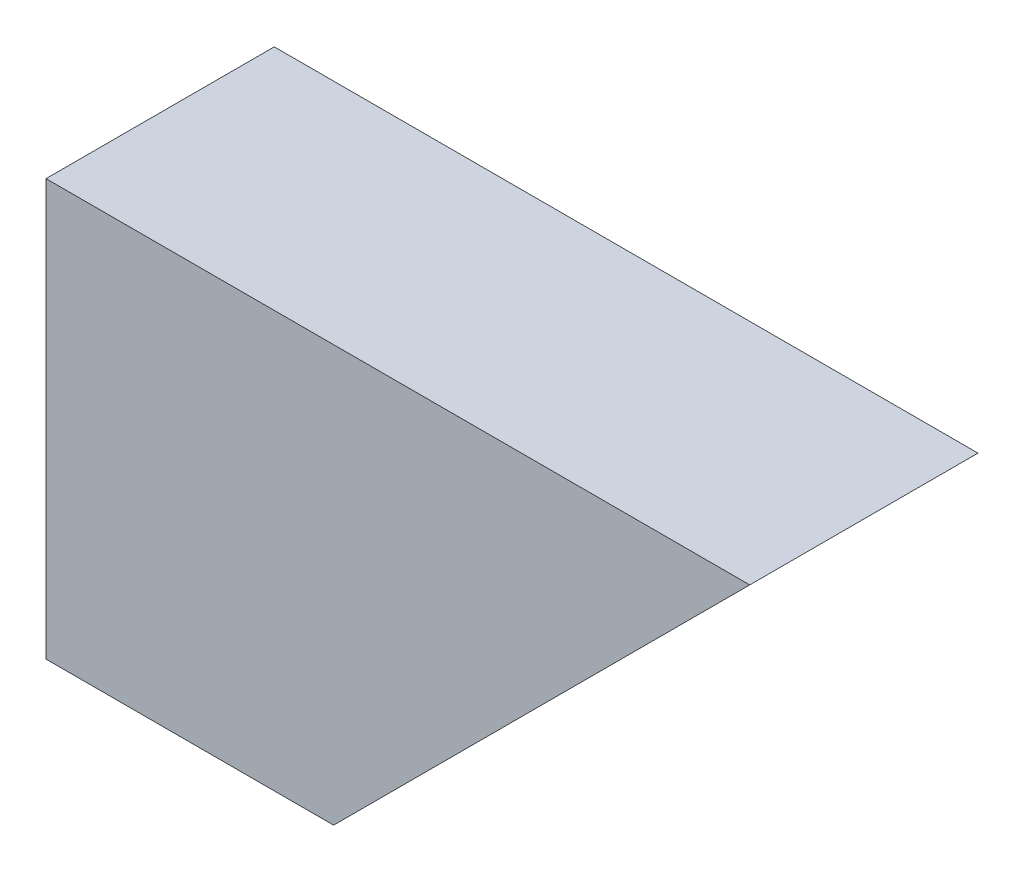
ISO-10303-21;
HEADER;
FILE_DESCRIPTION(('STEP AP214'),'2;1');
FILE_NAME('part.step','',(''),(''),'','','');
FILE_SCHEMA(('AUTOMOTIVE_DESIGN { 1 0 10303 214 1 1 1 1 }'));
ENDSEC;
DATA;
#1=APPLICATION_CONTEXT('core data for automotive mechanical design processes');
#2=APPLICATION_PROTOCOL_DEFINITION('international standard','automotive_design',2000,#1);
#3=PRODUCT_CONTEXT('',#1,'mechanical');
#4=PRODUCT('Part','Part','',(#3));
#5=PRODUCT_RELATED_PRODUCT_CATEGORY('part','',(#4));
#6=PRODUCT_DEFINITION_FORMATION('','',#4);
#7=PRODUCT_DEFINITION_CONTEXT('part definition',#1,'design');
#8=PRODUCT_DEFINITION('design','',#6,#7);
#9=PRODUCT_DEFINITION_SHAPE('','',#8);
#10=(LENGTH_UNIT() NAMED_UNIT(*) SI_UNIT(.MILLI.,.METRE.));
#11=(NAMED_UNIT(*) PLANE_ANGLE_UNIT() SI_UNIT($,.RADIAN.));
#12=(NAMED_UNIT(*) SI_UNIT($,.STERADIAN.) SOLID_ANGLE_UNIT());
#13=UNCERTAINTY_MEASURE_WITH_UNIT(LENGTH_MEASURE(1.E-05),#10,'distance_accuracy_value','');
#14=(GEOMETRIC_REPRESENTATION_CONTEXT(3) GLOBAL_UNCERTAINTY_ASSIGNED_CONTEXT((#13)) GLOBAL_UNIT_ASSIGNED_CONTEXT((#10,
#11,#12)) REPRESENTATION_CONTEXT('',''));
#15=CARTESIAN_POINT('',(0.,0.,0.));
#16=DIRECTION('',(0.,0.,1.));
#17=DIRECTION('',(1.,0.,0.));
#18=AXIS2_PLACEMENT_3D('',#15,#16,#17);
#19=CARTESIAN_POINT('',(154.15,91.1500000000004,50.));
#20=DIRECTION('',(-0.707106781186549,0.707106781186546,0.));
#21=DIRECTION('',(-0.707106781186546,-0.707106781186549,0.));
#22=AXIS2_PLACEMENT_3D('',#19,#20,#21);
#23=PLANE('',#22);
#24=DIRECTION('',(0.707106781186546,0.707106781186549,0.));
#25=VECTOR('',#24,1.);
#26=CARTESIAN_POINT('',(154.15,91.1500000000004,0.));
#27=LINE('',#26,#25);
#28=CARTESIAN_POINT('',(63.,0.,0.));
#29=VERTEX_POINT('',#28);
#30=CARTESIAN_POINT('',(154.15,91.1500000000004,0.));
#31=VERTEX_POINT('',#30);
#32=EDGE_CURVE('E96',#29,#31,#27,.T.);
#33=ORIENTED_EDGE('',*,*,#32,.T.);
#34=DIRECTION('',(0.,0.,-1.));
#35=VECTOR('',#34,1.);
#36=CARTESIAN_POINT('',(154.15,91.1500000000004,50.));
#37=LINE('',#36,#35);
#38=CARTESIAN_POINT('',(154.15,91.1500000000004,50.));
#39=VERTEX_POINT('',#38);
#40=EDGE_CURVE('E11',#39,#31,#37,.T.);
#41=ORIENTED_EDGE('',*,*,#40,.F.);
#42=DIRECTION('',(0.707106781186546,0.707106781186549,0.));
#43=VECTOR('',#42,1.);
#44=CARTESIAN_POINT('',(154.15,91.1500000000004,50.));
#45=LINE('',#44,#43);
#46=CARTESIAN_POINT('',(63.,0.,50.));
#47=VERTEX_POINT('',#46);
#48=EDGE_CURVE('E84',#47,#39,#45,.T.);
#49=ORIENTED_EDGE('',*,*,#48,.F.);
#50=DIRECTION('',(0.,0.,-1.));
#51=VECTOR('',#50,1.);
#52=CARTESIAN_POINT('',(63.,0.,50.));
#53=LINE('',#52,#51);
#54=EDGE_CURVE('E92',#47,#29,#53,.T.);
#55=ORIENTED_EDGE('',*,*,#54,.T.);
#56=EDGE_LOOP('',(#33,#41,#49,#55));
#57=FACE_BOUND('',#56,.T.);
#58=ADVANCED_FACE('F33',(#57),#23,.F.);
#59=CARTESIAN_POINT('',(0.,91.1500000000004,50.));
#60=DIRECTION('',(0.,-1.,0.));
#61=DIRECTION('',(0.,0.,-1.));
#62=AXIS2_PLACEMENT_3D('',#59,#60,#61);
#63=PLANE('',#62);
#64=DIRECTION('',(-1.,0.,0.));
#65=VECTOR('',#64,1.);
#66=CARTESIAN_POINT('',(0.,91.1500000000004,0.));
#67=LINE('',#66,#65);
#68=CARTESIAN_POINT('',(0.,91.1500000000004,0.));
#69=VERTEX_POINT('',#68);
#70=EDGE_CURVE('E88',#31,#69,#67,.T.);
#71=ORIENTED_EDGE('',*,*,#70,.T.);
#72=DIRECTION('',(0.,0.,-1.));
#73=VECTOR('',#72,1.);
#74=CARTESIAN_POINT('',(0.,91.1500000000004,50.));
#75=LINE('',#74,#73);
#76=CARTESIAN_POINT('',(0.,91.1500000000004,50.));
#77=VERTEX_POINT('',#76);
#78=EDGE_CURVE('E41',#77,#69,#75,.T.);
#79=ORIENTED_EDGE('',*,*,#78,.F.);
#80=DIRECTION('',(-1.,0.,0.));
#81=VECTOR('',#80,1.);
#82=CARTESIAN_POINT('',(0.,91.1500000000004,50.));
#83=LINE('',#82,#81);
#84=EDGE_CURVE('E79',#39,#77,#83,.T.);
#85=ORIENTED_EDGE('',*,*,#84,.F.);
#86=ORIENTED_EDGE('',*,*,#40,.T.);
#87=EDGE_LOOP('',(#71,#79,#85,#86));
#88=FACE_BOUND('',#87,.T.);
#89=ADVANCED_FACE('F87',(#88),#63,.F.);
#90=CARTESIAN_POINT('',(0.,0.,50.));
#91=DIRECTION('',(1.,0.,0.));
#92=DIRECTION('',(0.,0.,-1.));
#93=AXIS2_PLACEMENT_3D('',#90,#91,#92);
#94=PLANE('',#93);
#95=DIRECTION('',(0.,-1.,0.));
#96=VECTOR('',#95,1.);
#97=CARTESIAN_POINT('',(0.,0.,0.));
#98=LINE('',#97,#96);
#99=CARTESIAN_POINT('',(0.,0.,0.));
#100=VERTEX_POINT('',#99);
#101=EDGE_CURVE('E66',#69,#100,#98,.T.);
#102=ORIENTED_EDGE('',*,*,#101,.T.);
#103=DIRECTION('',(0.,0.,-1.));
#104=VECTOR('',#103,1.);
#105=CARTESIAN_POINT('',(0.,0.,50.));
#106=LINE('',#105,#104);
#107=CARTESIAN_POINT('',(0.,0.,50.));
#108=VERTEX_POINT('',#107);
#109=EDGE_CURVE('E89',#108,#100,#106,.T.);
#110=ORIENTED_EDGE('',*,*,#109,.F.);
#111=DIRECTION('',(0.,-1.,0.));
#112=VECTOR('',#111,1.);
#113=CARTESIAN_POINT('',(0.,0.,50.));
#114=LINE('',#113,#112);
#115=EDGE_CURVE('E82',#77,#108,#114,.T.);
#116=ORIENTED_EDGE('',*,*,#115,.F.);
#117=ORIENTED_EDGE('',*,*,#78,.T.);
#118=EDGE_LOOP('',(#102,#110,#116,#117));
#119=FACE_BOUND('',#118,.T.);
#120=ADVANCED_FACE('F90',(#119),#94,.F.);
#121=CARTESIAN_POINT('',(63.,0.,50.));
#122=DIRECTION('',(0.,1.,0.));
#123=DIRECTION('',(-1.,0.,0.));
#124=AXIS2_PLACEMENT_3D('',#121,#122,#123);
#125=PLANE('',#124);
#126=DIRECTION('',(1.,0.,0.));
#127=VECTOR('',#126,1.);
#128=CARTESIAN_POINT('',(63.,0.,0.));
#129=LINE('',#128,#127);
#130=EDGE_CURVE('E72',#100,#29,#129,.T.);
#131=ORIENTED_EDGE('',*,*,#130,.T.);
#132=ORIENTED_EDGE('',*,*,#54,.F.);
#133=DIRECTION('',(1.,0.,0.));
#134=VECTOR('',#133,1.);
#135=CARTESIAN_POINT('',(63.,0.,50.));
#136=LINE('',#135,#134);
#137=EDGE_CURVE('E49',#108,#47,#136,.T.);
#138=ORIENTED_EDGE('',*,*,#137,.F.);
#139=ORIENTED_EDGE('',*,*,#109,.T.);
#140=EDGE_LOOP('',(#131,#132,#138,#139));
#141=FACE_BOUND('',#140,.T.);
#142=ADVANCED_FACE('F103',(#141),#125,.F.);
#143=CARTESIAN_POINT('',(0.,0.,50.));
#144=DIRECTION('',(0.,0.,-1.));
#145=DIRECTION('',(-1.,0.,0.));
#146=AXIS2_PLACEMENT_3D('',#143,#144,#145);
#147=PLANE('',#146);
#148=ORIENTED_EDGE('',*,*,#48,.T.);
#149=ORIENTED_EDGE('',*,*,#84,.T.);
#150=ORIENTED_EDGE('',*,*,#115,.T.);
#151=ORIENTED_EDGE('',*,*,#137,.T.);
#152=EDGE_LOOP('',(#148,#149,#150,#151));
#153=FACE_BOUND('',#152,.T.);
#154=ADVANCED_FACE('F80',(#153),#147,.F.);
#155=CARTESIAN_POINT('',(0.,0.,0.));
#156=DIRECTION('',(0.,0.,-1.));
#157=DIRECTION('',(-1.,0.,0.));
#158=AXIS2_PLACEMENT_3D('',#155,#156,#157);
#159=PLANE('',#158);
#160=ORIENTED_EDGE('',*,*,#32,.F.);
#161=ORIENTED_EDGE('',*,*,#130,.F.);
#162=ORIENTED_EDGE('',*,*,#101,.F.);
#163=ORIENTED_EDGE('',*,*,#70,.F.);
#164=EDGE_LOOP('',(#160,#161,#162,#163));
#165=FACE_BOUND('',#164,.T.);
#166=ADVANCED_FACE('F106',(#165),#159,.T.);
#167=CLOSED_SHELL('',(#58,#89,#120,#142,#154,#166));
#168=MANIFOLD_SOLID_BREP('B2',#167);
#169=ADVANCED_BREP_SHAPE_REPRESENTATION('',(#18,#168),#14);
#170=SHAPE_DEFINITION_REPRESENTATION(#9,#169);
ENDSEC;
END-ISO-10303-21;
